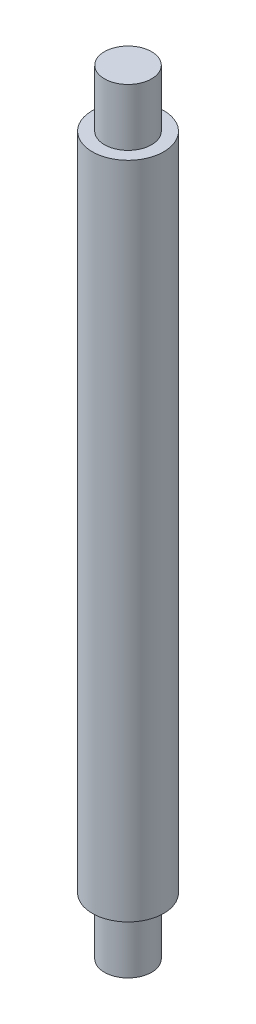
ISO-10303-21;
HEADER;
FILE_DESCRIPTION(('STEP AP214'),'2;1');
FILE_NAME('part.step','',(''),(''),'','','');
FILE_SCHEMA(('AUTOMOTIVE_DESIGN { 1 0 10303 214 1 1 1 1 }'));
ENDSEC;
DATA;
#1=APPLICATION_CONTEXT('core data for automotive mechanical design processes');
#2=APPLICATION_PROTOCOL_DEFINITION('international standard','automotive_design',2000,#1);
#3=PRODUCT_CONTEXT('',#1,'mechanical');
#4=PRODUCT('Part','Part','',(#3));
#5=PRODUCT_RELATED_PRODUCT_CATEGORY('part','',(#4));
#6=PRODUCT_DEFINITION_FORMATION('','',#4);
#7=PRODUCT_DEFINITION_CONTEXT('part definition',#1,'design');
#8=PRODUCT_DEFINITION('design','',#6,#7);
#9=PRODUCT_DEFINITION_SHAPE('','',#8);
#10=(LENGTH_UNIT() NAMED_UNIT(*) SI_UNIT(.MILLI.,.METRE.));
#11=(NAMED_UNIT(*) PLANE_ANGLE_UNIT() SI_UNIT($,.RADIAN.));
#12=(NAMED_UNIT(*) SI_UNIT($,.STERADIAN.) SOLID_ANGLE_UNIT());
#13=UNCERTAINTY_MEASURE_WITH_UNIT(LENGTH_MEASURE(1.E-05),#10,'distance_accuracy_value','');
#14=(GEOMETRIC_REPRESENTATION_CONTEXT(3) GLOBAL_UNCERTAINTY_ASSIGNED_CONTEXT((#13)) GLOBAL_UNIT_ASSIGNED_CONTEXT((#10,
#11,#12)) REPRESENTATION_CONTEXT('',''));
#15=CARTESIAN_POINT('',(0.,0.,0.));
#16=DIRECTION('',(0.,0.,1.));
#17=DIRECTION('',(1.,0.,0.));
#18=AXIS2_PLACEMENT_3D('',#15,#16,#17);
#19=CARTESIAN_POINT('',(0.,54.2,0.));
#20=DIRECTION('',(0.,-1.,0.));
#21=DIRECTION('',(0.,0.,-1.));
#22=AXIS2_PLACEMENT_3D('',#19,#20,#21);
#23=CYLINDRICAL_SURFACE('',#22,5.);
#24=CARTESIAN_POINT('',(0.,46.2,0.));
#25=DIRECTION('',(0.,1.,0.));
#26=DIRECTION('',(0.,0.,1.));
#27=AXIS2_PLACEMENT_3D('',#24,#25,#26);
#28=CIRCLE('',#27,5.);
#29=CARTESIAN_POINT('',(0.,46.2,-5.));
#30=VERTEX_POINT('',#29);
#31=EDGE_CURVE('E10',#30,#30,#28,.T.);
#32=CARTESIAN_POINT('',(0.,-46.2,0.));
#33=DIRECTION('',(0.,1.,0.));
#34=DIRECTION('',(0.,0.,1.));
#35=AXIS2_PLACEMENT_3D('',#32,#33,#34);
#36=CIRCLE('',#35,5.);
#37=CARTESIAN_POINT('',(0.,-46.2,-5.));
#38=VERTEX_POINT('',#37);
#39=EDGE_CURVE('E48',#38,#38,#36,.T.);
#40=CARTESIAN_POINT('',(0.,46.2,-5.));
#41=CARTESIAN_POINT('',(0.,45.2375,-5.));
#42=CARTESIAN_POINT('',(0.,44.275,-5.));
#43=CARTESIAN_POINT('',(0.,42.35,-5.));
#44=CARTESIAN_POINT('',(0.,41.3875,-5.));
#45=CARTESIAN_POINT('',(0.,39.4625,-5.));
#46=CARTESIAN_POINT('',(0.,38.5,-5.));
#47=CARTESIAN_POINT('',(0.,36.575,-5.));
#48=CARTESIAN_POINT('',(0.,35.6125,-5.));
#49=CARTESIAN_POINT('',(0.,33.6875,-5.));
#50=CARTESIAN_POINT('',(0.,32.725,-5.));
#51=CARTESIAN_POINT('',(0.,30.8,-5.));
#52=CARTESIAN_POINT('',(0.,29.8375,-5.));
#53=CARTESIAN_POINT('',(0.,27.9125,-5.));
#54=CARTESIAN_POINT('',(0.,26.95,-5.));
#55=CARTESIAN_POINT('',(0.,25.025,-5.));
#56=CARTESIAN_POINT('',(0.,24.0625,-5.));
#57=CARTESIAN_POINT('',(0.,22.1375,-5.));
#58=CARTESIAN_POINT('',(0.,21.175,-5.));
#59=CARTESIAN_POINT('',(0.,19.25,-5.));
#60=CARTESIAN_POINT('',(0.,18.2875,-5.));
#61=CARTESIAN_POINT('',(0.,16.3625,-5.));
#62=CARTESIAN_POINT('',(0.,15.4,-5.));
#63=CARTESIAN_POINT('',(0.,13.475,-5.));
#64=CARTESIAN_POINT('',(0.,12.5125,-5.));
#65=CARTESIAN_POINT('',(0.,10.5875,-5.));
#66=CARTESIAN_POINT('',(0.,9.625,-5.));
#67=CARTESIAN_POINT('',(0.,7.7,-5.));
#68=CARTESIAN_POINT('',(0.,6.7375,-5.));
#69=CARTESIAN_POINT('',(0.,4.8125,-5.));
#70=CARTESIAN_POINT('',(0.,3.85,-5.));
#71=CARTESIAN_POINT('',(0.,1.925,-5.));
#72=CARTESIAN_POINT('',(0.,0.9625,-5.));
#73=CARTESIAN_POINT('',(0.,-0.9625,-5.));
#74=CARTESIAN_POINT('',(0.,-1.925,-5.));
#75=CARTESIAN_POINT('',(0.,-3.85,-5.));
#76=CARTESIAN_POINT('',(0.,-4.8125,-5.));
#77=CARTESIAN_POINT('',(0.,-6.7375,-5.));
#78=CARTESIAN_POINT('',(0.,-7.7,-5.));
#79=CARTESIAN_POINT('',(0.,-9.625,-5.));
#80=CARTESIAN_POINT('',(0.,-10.5875,-5.));
#81=CARTESIAN_POINT('',(0.,-12.5125,-5.));
#82=CARTESIAN_POINT('',(0.,-13.475,-5.));
#83=CARTESIAN_POINT('',(0.,-15.4,-5.));
#84=CARTESIAN_POINT('',(0.,-16.3625,-5.));
#85=CARTESIAN_POINT('',(0.,-18.2875,-5.));
#86=CARTESIAN_POINT('',(0.,-19.25,-5.));
#87=CARTESIAN_POINT('',(0.,-21.175,-5.));
#88=CARTESIAN_POINT('',(0.,-22.1375,-5.));
#89=CARTESIAN_POINT('',(0.,-24.0625,-5.));
#90=CARTESIAN_POINT('',(0.,-25.025,-5.));
#91=CARTESIAN_POINT('',(0.,-26.95,-5.));
#92=CARTESIAN_POINT('',(0.,-27.9125,-5.));
#93=CARTESIAN_POINT('',(0.,-29.8375,-5.));
#94=CARTESIAN_POINT('',(0.,-30.8,-5.));
#95=CARTESIAN_POINT('',(0.,-32.725,-5.));
#96=CARTESIAN_POINT('',(0.,-33.6875,-5.));
#97=CARTESIAN_POINT('',(0.,-35.6125,-5.));
#98=CARTESIAN_POINT('',(0.,-36.575,-5.));
#99=CARTESIAN_POINT('',(0.,-38.5,-5.));
#100=CARTESIAN_POINT('',(0.,-39.4625,-5.));
#101=CARTESIAN_POINT('',(0.,-41.3875,-5.));
#102=CARTESIAN_POINT('',(0.,-42.35,-5.));
#103=CARTESIAN_POINT('',(0.,-44.275,-5.));
#104=CARTESIAN_POINT('',(0.,-45.2375,-5.));
#105=CARTESIAN_POINT('',(0.,-46.2,-5.));
#106=B_SPLINE_CURVE_WITH_KNOTS('',3,(#40,#41,#42,#43,#44,#45,#46,#47,#48,#49,#50,#51,#52,#53,
#54,#55,#56,#57,#58,#59,#60,#61,#62,#63,#64,#65,#66,#67,#68,#69,#70,#71,#72,#73,#74,#75,#76,#77,
#78,#79,#80,#81,#82,#83,#84,#85,#86,#87,#88,#89,#90,#91,#92,#93,#94,#95,#96,#97,#98,#99,#100,
#101,#102,#103,#104,#105),.UNSPECIFIED.,.F.,.F.,(4,2,2,2,2,2,2,2,2,2,2,2,2,2,2,2,2,2,2,2,2,2,2,
2,2,2,2,2,2,2,2,2,4),(0.,2.8875,5.775,8.6625,11.55,14.4375,17.325,20.2125,23.1,25.9875,28.875,
31.7625,34.65,37.5375,40.425,43.3125,46.2,49.0875,51.975,54.8625,57.75,60.6375,63.525,66.4125,
69.3,72.1875,75.075,77.9625,80.85,83.7375,86.625,89.5125,92.4),.UNSPECIFIED.);
#107=EDGE_CURVE('BSEAM33',#30,#38,#106,.T.);
#108=ORIENTED_EDGE('',*,*,#31,.F.);
#109=ORIENTED_EDGE('',*,*,#39,.T.);
#110=ORIENTED_EDGE('',*,*,#107,.T.);
#111=ORIENTED_EDGE('',*,*,#107,.F.);
#112=EDGE_LOOP('',(#108,#110,#109,#111));
#113=FACE_BOUND('',#112,.T.);
#114=ADVANCED_FACE('F33',(#113),#23,.T.);
#115=CARTESIAN_POINT('',(0.,46.2,0.));
#116=DIRECTION('',(0.,1.,0.));
#117=DIRECTION('',(0.,0.,1.));
#118=AXIS2_PLACEMENT_3D('',#115,#116,#117);
#119=PLANE('',#118);
#120=CARTESIAN_POINT('',(0.,46.2,0.));
#121=DIRECTION('',(0.,1.,0.));
#122=DIRECTION('',(0.,0.,1.));
#123=AXIS2_PLACEMENT_3D('',#120,#121,#122);
#124=CIRCLE('',#123,3.3);
#125=CARTESIAN_POINT('',(0.,46.2,3.3));
#126=VERTEX_POINT('',#125);
#127=EDGE_CURVE('E39',#126,#126,#124,.T.);
#128=ORIENTED_EDGE('',*,*,#127,.F.);
#129=EDGE_LOOP('',(#128));
#130=FACE_BOUND('',#129,.T.);
#131=ORIENTED_EDGE('',*,*,#31,.T.);
#132=EDGE_LOOP('',(#131));
#133=FACE_BOUND('',#132,.T.);
#134=ADVANCED_FACE('F73',(#130,#133),#119,.T.);
#135=CARTESIAN_POINT('',(0.,46.2,0.));
#136=DIRECTION('',(0.,1.,0.));
#137=DIRECTION('',(0.,0.,1.));
#138=AXIS2_PLACEMENT_3D('',#135,#136,#137);
#139=CYLINDRICAL_SURFACE('',#138,3.3);
#140=ORIENTED_EDGE('',*,*,#127,.T.);
#141=EDGE_LOOP('',(#140));
#142=FACE_BOUND('',#141,.T.);
#143=CARTESIAN_POINT('',(0.,54.2,0.));
#144=DIRECTION('',(0.,1.,0.));
#145=DIRECTION('',(0.,0.,1.));
#146=AXIS2_PLACEMENT_3D('',#143,#144,#145);
#147=CIRCLE('',#146,3.3);
#148=CARTESIAN_POINT('',(0.,54.2,3.3));
#149=VERTEX_POINT('',#148);
#150=EDGE_CURVE('E43',#149,#149,#147,.T.);
#151=ORIENTED_EDGE('',*,*,#150,.F.);
#152=EDGE_LOOP('',(#151));
#153=FACE_BOUND('',#152,.T.);
#154=ADVANCED_FACE('F78',(#142,#153),#139,.T.);
#155=CARTESIAN_POINT('',(0.,54.2,0.));
#156=DIRECTION('',(0.,1.,0.));
#157=DIRECTION('',(0.,0.,1.));
#158=AXIS2_PLACEMENT_3D('',#155,#156,#157);
#159=PLANE('',#158);
#160=ORIENTED_EDGE('',*,*,#150,.T.);
#161=EDGE_LOOP('',(#160));
#162=FACE_BOUND('',#161,.T.);
#163=ADVANCED_FACE('F85',(#162),#159,.T.);
#164=CARTESIAN_POINT('',(0.,-46.2,0.));
#165=DIRECTION('',(0.,-1.,0.));
#166=DIRECTION('',(0.,0.,1.));
#167=AXIS2_PLACEMENT_3D('',#164,#165,#166);
#168=PLANE('',#167);
#169=ORIENTED_EDGE('',*,*,#39,.F.);
#170=EDGE_LOOP('',(#169));
#171=FACE_BOUND('',#170,.T.);
#172=CARTESIAN_POINT('',(0.,-46.2,0.));
#173=DIRECTION('',(0.,1.,0.));
#174=DIRECTION('',(0.,0.,1.));
#175=AXIS2_PLACEMENT_3D('',#172,#173,#174);
#176=CIRCLE('',#175,3.3);
#177=CARTESIAN_POINT('',(0.,-46.2,3.3));
#178=VERTEX_POINT('',#177);
#179=EDGE_CURVE('E52',#178,#178,#176,.T.);
#180=ORIENTED_EDGE('',*,*,#179,.T.);
#181=EDGE_LOOP('',(#180));
#182=FACE_BOUND('',#181,.T.);
#183=ADVANCED_FACE('F59',(#171,#182),#168,.T.);
#184=CARTESIAN_POINT('',(0.,-46.2,0.));
#185=DIRECTION('',(0.,-1.,0.));
#186=DIRECTION('',(0.,0.,-1.));
#187=AXIS2_PLACEMENT_3D('',#184,#185,#186);
#188=CYLINDRICAL_SURFACE('',#187,3.3);
#189=ORIENTED_EDGE('',*,*,#179,.F.);
#190=EDGE_LOOP('',(#189));
#191=FACE_BOUND('',#190,.T.);
#192=CARTESIAN_POINT('',(0.,-54.2,0.));
#193=DIRECTION('',(0.,1.,0.));
#194=DIRECTION('',(0.,0.,1.));
#195=AXIS2_PLACEMENT_3D('',#192,#193,#194);
#196=CIRCLE('',#195,3.3);
#197=CARTESIAN_POINT('',(0.,-54.2,3.3));
#198=VERTEX_POINT('',#197);
#199=EDGE_CURVE('E53',#198,#198,#196,.T.);
#200=ORIENTED_EDGE('',*,*,#199,.T.);
#201=EDGE_LOOP('',(#200));
#202=FACE_BOUND('',#201,.T.);
#203=ADVANCED_FACE('F61',(#191,#202),#188,.T.);
#204=CARTESIAN_POINT('',(0.,-54.2,0.));
#205=DIRECTION('',(0.,1.,0.));
#206=DIRECTION('',(0.,0.,1.));
#207=AXIS2_PLACEMENT_3D('',#204,#205,#206);
#208=PLANE('',#207);
#209=ORIENTED_EDGE('',*,*,#199,.F.);
#210=EDGE_LOOP('',(#209));
#211=FACE_BOUND('',#210,.T.);
#212=ADVANCED_FACE('F64',(#211),#208,.F.);
#213=CLOSED_SHELL('',(#114,#134,#154,#163,#183,#203,#212));
#214=MANIFOLD_SOLID_BREP('B2',#213);
#215=ADVANCED_BREP_SHAPE_REPRESENTATION('',(#18,#214),#14);
#216=SHAPE_DEFINITION_REPRESENTATION(#9,#215);
ENDSEC;
END-ISO-10303-21;
